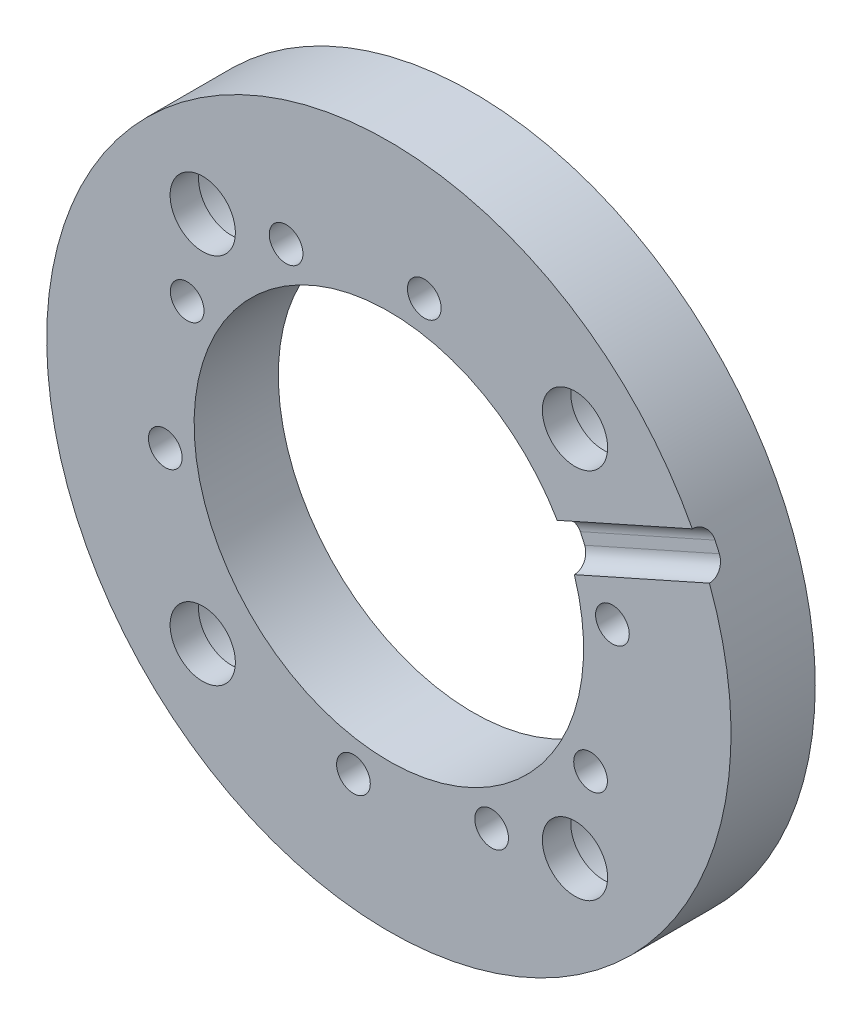
ISO-10303-21;
HEADER;
FILE_DESCRIPTION(('STEP AP214'),'2;1');
FILE_NAME('part.step','',(''),(''),'','','');
FILE_SCHEMA(('AUTOMOTIVE_DESIGN { 1 0 10303 214 1 1 1 1 }'));
ENDSEC;
DATA;
#1=APPLICATION_CONTEXT('core data for automotive mechanical design processes');
#2=APPLICATION_PROTOCOL_DEFINITION('international standard','automotive_design',2000,#1);
#3=PRODUCT_CONTEXT('',#1,'mechanical');
#4=PRODUCT('Part','Part','',(#3));
#5=PRODUCT_RELATED_PRODUCT_CATEGORY('part','',(#4));
#6=PRODUCT_DEFINITION_FORMATION('','',#4);
#7=PRODUCT_DEFINITION_CONTEXT('part definition',#1,'design');
#8=PRODUCT_DEFINITION('design','',#6,#7);
#9=PRODUCT_DEFINITION_SHAPE('','',#8);
#10=(LENGTH_UNIT() NAMED_UNIT(*) SI_UNIT(.MILLI.,.METRE.));
#11=(NAMED_UNIT(*) PLANE_ANGLE_UNIT() SI_UNIT($,.RADIAN.));
#12=(NAMED_UNIT(*) SI_UNIT($,.STERADIAN.) SOLID_ANGLE_UNIT());
#13=UNCERTAINTY_MEASURE_WITH_UNIT(LENGTH_MEASURE(1.E-05),#10,'distance_accuracy_value','');
#14=(GEOMETRIC_REPRESENTATION_CONTEXT(3) GLOBAL_UNCERTAINTY_ASSIGNED_CONTEXT((#13)) GLOBAL_UNIT_ASSIGNED_CONTEXT((#10,
#11,#12)) REPRESENTATION_CONTEXT('',''));
#15=CARTESIAN_POINT('',(0.,0.,0.));
#16=DIRECTION('',(0.,0.,1.));
#17=DIRECTION('',(1.,0.,0.));
#18=AXIS2_PLACEMENT_3D('',#15,#16,#17);
#19=CARTESIAN_POINT('',(-17.6776695296636,-17.6776695296637,8.));
#20=DIRECTION('',(0.,0.,-1.));
#21=DIRECTION('',(-1.,0.,0.));
#22=AXIS2_PLACEMENT_3D('',#19,#20,#21);
#23=CYLINDRICAL_SURFACE('',#22,3.10000000000017);
#24=CARTESIAN_POINT('',(-17.6776695296636,-17.6776695296637,5.3));
#25=DIRECTION('',(0.,0.,1.));
#26=DIRECTION('',(1.,0.,0.));
#27=AXIS2_PLACEMENT_3D('',#24,#25,#26);
#28=CIRCLE('',#27,3.10000000000017);
#29=CARTESIAN_POINT('',(-14.5776695296635,-17.6776695296637,5.3));
#30=VERTEX_POINT('',#29);
#31=EDGE_CURVE('E303',#30,#30,#28,.T.);
#32=ORIENTED_EDGE('',*,*,#31,.F.);
#33=EDGE_LOOP('',(#32));
#34=FACE_BOUND('',#33,.T.);
#35=CARTESIAN_POINT('',(-17.6776695296636,-17.6776695296637,8.));
#36=DIRECTION('',(0.,0.,1.));
#37=DIRECTION('',(1.,0.,0.));
#38=AXIS2_PLACEMENT_3D('',#35,#36,#37);
#39=CIRCLE('',#38,3.10000000000017);
#40=CARTESIAN_POINT('',(-14.5776695296635,-17.6776695296637,8.));
#41=VERTEX_POINT('',#40);
#42=EDGE_CURVE('E114',#41,#41,#39,.T.);
#43=ORIENTED_EDGE('',*,*,#42,.T.);
#44=EDGE_LOOP('',(#43));
#45=FACE_BOUND('',#44,.T.);
#46=ADVANCED_FACE('F41',(#34,#45),#23,.F.);
#47=CARTESIAN_POINT('',(-17.6776695296637,17.6776695296636,8.));
#48=DIRECTION('',(0.,0.,-1.));
#49=DIRECTION('',(-1.,0.,0.));
#50=AXIS2_PLACEMENT_3D('',#47,#48,#49);
#51=CYLINDRICAL_SURFACE('',#50,3.1);
#52=CARTESIAN_POINT('',(-17.6776695296637,17.6776695296636,5.3));
#53=DIRECTION('',(0.,0.,1.));
#54=DIRECTION('',(1.,0.,0.));
#55=AXIS2_PLACEMENT_3D('',#52,#53,#54);
#56=CIRCLE('',#55,3.1);
#57=CARTESIAN_POINT('',(-14.5776695296637,17.6776695296636,5.3));
#58=VERTEX_POINT('',#57);
#59=EDGE_CURVE('E290',#58,#58,#56,.T.);
#60=ORIENTED_EDGE('',*,*,#59,.F.);
#61=EDGE_LOOP('',(#60));
#62=FACE_BOUND('',#61,.T.);
#63=CARTESIAN_POINT('',(-17.6776695296637,17.6776695296636,8.));
#64=DIRECTION('',(0.,0.,1.));
#65=DIRECTION('',(1.,0.,0.));
#66=AXIS2_PLACEMENT_3D('',#63,#64,#65);
#67=CIRCLE('',#66,3.1);
#68=CARTESIAN_POINT('',(-14.5776695296637,17.6776695296636,8.));
#69=VERTEX_POINT('',#68);
#70=EDGE_CURVE('E267',#69,#69,#67,.T.);
#71=ORIENTED_EDGE('',*,*,#70,.T.);
#72=EDGE_LOOP('',(#71));
#73=FACE_BOUND('',#72,.T.);
#74=ADVANCED_FACE('F161',(#62,#73),#51,.F.);
#75=CARTESIAN_POINT('',(17.6776695296637,17.6776695296637,8.));
#76=DIRECTION('',(0.,0.,-1.));
#77=DIRECTION('',(-1.,0.,0.));
#78=AXIS2_PLACEMENT_3D('',#75,#76,#77);
#79=CYLINDRICAL_SURFACE('',#78,3.1);
#80=CARTESIAN_POINT('',(17.6776695296637,17.6776695296637,5.3));
#81=DIRECTION('',(0.,0.,1.));
#82=DIRECTION('',(1.,0.,0.));
#83=AXIS2_PLACEMENT_3D('',#80,#81,#82);
#84=CIRCLE('',#83,3.1);
#85=CARTESIAN_POINT('',(20.7776695296637,17.6776695296637,5.3));
#86=VERTEX_POINT('',#85);
#87=EDGE_CURVE('E280',#86,#86,#84,.T.);
#88=ORIENTED_EDGE('',*,*,#87,.F.);
#89=EDGE_LOOP('',(#88));
#90=FACE_BOUND('',#89,.T.);
#91=CARTESIAN_POINT('',(17.6776695296637,17.6776695296637,8.));
#92=DIRECTION('',(0.,0.,1.));
#93=DIRECTION('',(1.,0.,0.));
#94=AXIS2_PLACEMENT_3D('',#91,#92,#93);
#95=CIRCLE('',#94,3.1);
#96=CARTESIAN_POINT('',(20.7776695296637,17.6776695296637,8.));
#97=VERTEX_POINT('',#96);
#98=EDGE_CURVE('E102',#97,#97,#95,.T.);
#99=ORIENTED_EDGE('',*,*,#98,.T.);
#100=EDGE_LOOP('',(#99));
#101=FACE_BOUND('',#100,.T.);
#102=ADVANCED_FACE('F153',(#90,#101),#79,.F.);
#103=CARTESIAN_POINT('',(0.,0.,8.));
#104=DIRECTION('',(0.,0.,-1.));
#105=DIRECTION('',(-1.,0.,0.));
#106=AXIS2_PLACEMENT_3D('',#103,#104,#105);
#107=CYLINDRICAL_SURFACE('',#106,32.5);
#108=CARTESIAN_POINT('',(0.,0.,8.));
#109=DIRECTION('',(0.,0.,1.));
#110=DIRECTION('',(1.,0.,0.));
#111=AXIS2_PLACEMENT_3D('',#108,#109,#110);
#112=CIRCLE('',#111,32.5);
#113=CARTESIAN_POINT('',(28.8204825798909,15.0209781260144,8.));
#114=VERTEX_POINT('',#113);
#115=CARTESIAN_POINT('',(30.4474291521941,11.366796295444,8.));
#116=VERTEX_POINT('',#115);
#117=EDGE_CURVE('E90',#114,#116,#112,.T.);
#118=ORIENTED_EDGE('',*,*,#117,.F.);
#119=CARTESIAN_POINT('',(28.8204825798909,15.0209781260144,8.));
#120=CARTESIAN_POINT('',(28.820482254931,15.0209777250137,7.95784392466187));
#121=CARTESIAN_POINT('',(28.8213060683507,15.01939822818,7.91570807938129));
#122=CARTESIAN_POINT('',(28.8245896321532,15.0130959887507,7.8317386113487));
#123=CARTESIAN_POINT('',(28.8270492938715,15.0083734165125,7.78990497234107));
#124=CARTESIAN_POINT('',(28.8368524106547,14.9895348988056,7.66538622060936));
#125=CARTESIAN_POINT('',(28.8466200905457,14.9707480300527,7.58353629685353));
#126=CARTESIAN_POINT('',(28.8722737388597,14.921212345629,7.42455693511093));
#127=CARTESIAN_POINT('',(28.8881624625773,14.8904581429821,7.34742964108981));
#128=CARTESIAN_POINT('',(28.925490073675,14.8178164712849,7.20007215072111));
#129=CARTESIAN_POINT('',(28.9469281264252,14.7759306764225,7.12984091938135));
#130=CARTESIAN_POINT('',(28.9946334093422,14.6820978859544,6.99818278185046));
#131=CARTESIAN_POINT('',(29.0209059961161,14.6301397268382,6.93676577740842));
#132=CARTESIAN_POINT('',(29.0773760501031,14.5175809949502,6.8245469356392));
#133=CARTESIAN_POINT('',(29.1075742960054,14.4569787073066,6.77374720957013));
#134=CARTESIAN_POINT('',(29.1709319336428,14.3287071736537,6.68415524729376));
#135=CARTESIAN_POINT('',(29.2040953194536,14.2610283740763,6.64537953131189));
#136=CARTESIAN_POINT('',(29.272279482007,14.1205429375697,6.58104833404386));
#137=CARTESIAN_POINT('',(29.3072991460254,14.0477393642296,6.55548502936798));
#138=CARTESIAN_POINT('',(29.3660146649431,13.9244437206533,6.52463115771624));
#139=CARTESIAN_POINT('',(29.3895027218427,13.8748027769776,6.51540077207948));
#140=CARTESIAN_POINT('',(29.436483060441,13.7748517717456,6.5030858134872));
#141=CARTESIAN_POINT('',(29.4599752909822,13.7245427350557,6.4999927241683));
#142=CARTESIAN_POINT('',(29.483345207539,13.6741491645033,6.5));
#143=B_SPLINE_CURVE_WITH_KNOTS('',3,(#119,#120,#121,#122,#123,#124,#125,#126,#127,#128,#129,
#130,#131,#132,#133,#134,#135,#136,#137,#138,#139,#140,#141,#142),.UNSPECIFIED.,.F.,.F.,(4,2,2,
2,2,2,2,2,2,2,2,4),(0.,0.126390434607027,0.252774019300377,0.505105879379107,0.75755145576971,
1.00995908589155,1.2626480832942,1.51538728049023,1.76847220225855,2.02140709411676,
2.18814972153659,2.35466080780035),.UNSPECIFIED.);
#144=CARTESIAN_POINT('',(29.483345207539,13.6741491645033,6.5));
#145=VERTEX_POINT('',#144);
#146=EDGE_CURVE('E70',#114,#145,#143,.T.);
#147=ORIENTED_EDGE('',*,*,#146,.T.);
#148=CARTESIAN_POINT('',(0.,0.,6.5));
#149=DIRECTION('',(0.,0.,-1.));
#150=DIRECTION('',(-1.,0.,0.));
#151=AXIS2_PLACEMENT_3D('',#148,#149,#150);
#152=CIRCLE('',#151,32.5);
#153=CARTESIAN_POINT('',(29.8900818506148,12.7606037068607,6.5));
#154=VERTEX_POINT('',#153);
#155=EDGE_CURVE('E91',#145,#154,#152,.T.);
#156=ORIENTED_EDGE('',*,*,#155,.T.);
#157=CARTESIAN_POINT('',(29.8900818506148,12.7606037068607,6.5));
#158=CARTESIAN_POINT('',(29.9066538793367,12.7217870228504,6.50000025653169));
#159=CARTESIAN_POINT('',(29.923141383252,12.6829563157621,6.50178205968444));
#160=CARTESIAN_POINT('',(29.9558489567163,12.6055097481665,6.50888959441266));
#161=CARTESIAN_POINT('',(29.9720690408145,12.5668938760468,6.5142151325304));
#162=CARTESIAN_POINT('',(30.0201288149045,12.4518568743887,6.53545481473923));
#163=CARTESIAN_POINT('',(30.0514249934655,12.37611283941,6.55663217746557));
#164=CARTESIAN_POINT('',(30.1116854951004,12.228767496804,6.61242818330965));
#165=CARTESIAN_POINT('',(30.1406487646226,12.1571680649584,6.64705285865403));
#166=CARTESIAN_POINT('',(30.1955399261491,12.0201836161517,6.72875562206615));
#167=CARTESIAN_POINT('',(30.2214682854676,11.9547976427372,6.7758317892097));
#168=CARTESIAN_POINT('',(30.2697179366694,11.832097687657,6.88115123009997));
#169=CARTESIAN_POINT('',(30.2920361375668,11.7747906284227,6.93940398083845));
#170=CARTESIAN_POINT('',(30.3325644080703,11.6699914922614,7.065418847027));
#171=CARTESIAN_POINT('',(30.3507736858683,11.6225013072382,7.13318279125315));
#172=CARTESIAN_POINT('',(30.382710822285,11.538756419885,7.27630355965674));
#173=CARTESIAN_POINT('',(30.3964374784227,11.5025047324586,7.35166241411603));
#174=CARTESIAN_POINT('',(30.4191294944356,11.4423599192547,7.50781004169035));
#175=CARTESIAN_POINT('',(30.4280977211173,11.4184593525353,7.58859551230668));
#176=CARTESIAN_POINT('',(30.4388720432389,11.3896978077847,7.72489920893655));
#177=CARTESIAN_POINT('',(30.442080488799,11.3811159246959,7.77955438586827));
#178=CARTESIAN_POINT('',(30.4463580433644,11.369665454334,7.88946529473925));
#179=CARTESIAN_POINT('',(30.4474301310718,11.3667889121884,7.94472008234201));
#180=CARTESIAN_POINT('',(30.4474291521941,11.366796295444,8.));
#181=B_SPLINE_CURVE_WITH_KNOTS('',3,(#157,#158,#159,#160,#161,#162,#163,#164,#165,#166,#167,
#168,#169,#170,#171,#172,#173,#174,#175,#176,#177,#178,#179,#180),.UNSPECIFIED.,.F.,.F.,(4,2,2,
2,2,2,2,2,2,2,2,4),(0.,0.126540793011442,0.253074678541132,0.505712504215108,0.758463789891964,
1.01117610568732,1.26410365920113,1.51707991145309,1.77012396994769,2.02301540361321,
2.1889526482996,2.35465836603808),.UNSPECIFIED.);
#182=EDGE_CURVE('E56',#154,#116,#181,.T.);
#183=ORIENTED_EDGE('',*,*,#182,.T.);
#184=EDGE_LOOP('',(#118,#147,#156,#183));
#185=FACE_BOUND('',#184,.T.);
#186=CARTESIAN_POINT('',(0.,0.,0.));
#187=DIRECTION('',(0.,0.,1.));
#188=DIRECTION('',(1.,0.,0.));
#189=AXIS2_PLACEMENT_3D('',#186,#187,#188);
#190=CIRCLE('',#189,32.5);
#191=CARTESIAN_POINT('',(32.5,0.,0.));
#192=VERTEX_POINT('',#191);
#193=EDGE_CURVE('E117',#192,#192,#190,.T.);
#194=ORIENTED_EDGE('',*,*,#193,.T.);
#195=EDGE_LOOP('',(#194));
#196=FACE_BOUND('',#195,.T.);
#197=ADVANCED_FACE('F88',(#185,#196),#107,.T.);
#198=CARTESIAN_POINT('',(0.,0.,8.));
#199=DIRECTION('',(0.,0.,-1.));
#200=DIRECTION('',(-1.,0.,0.));
#201=AXIS2_PLACEMENT_3D('',#198,#199,#200);
#202=CYLINDRICAL_SURFACE('',#201,18.5);
#203=CARTESIAN_POINT('',(0.,0.,6.5));
#204=DIRECTION('',(0.,0.,-1.));
#205=DIRECTION('',(-1.,0.,0.));
#206=AXIS2_PLACEMENT_3D('',#203,#204,#205);
#207=CIRCLE('',#206,18.5);
#208=CARTESIAN_POINT('',(16.6910489127844,7.97865190311243,6.5));
#209=VERTEX_POINT('',#208);
#210=CARTESIAN_POINT('',(17.0977855558602,7.06510644546983,6.5));
#211=VERTEX_POINT('',#210);
#212=EDGE_CURVE('E111',#209,#211,#207,.T.);
#213=ORIENTED_EDGE('',*,*,#212,.F.);
#214=CARTESIAN_POINT('',(16.6910489127844,7.97865190311243,6.5));
#215=CARTESIAN_POINT('',(16.6728433696581,8.01673911332421,6.50000020622001));
#216=CARTESIAN_POINT('',(16.6545146518703,8.05474478725962,6.50178188332618));
#217=CARTESIAN_POINT('',(16.6177321589642,8.13035923339829,6.50888723931646));
#218=CARTESIAN_POINT('',(16.5992783924816,8.16796803255921,6.51421067603338));
#219=CARTESIAN_POINT('',(16.5439742076894,8.27972177031654,6.53543704634188));
#220=CARTESIAN_POINT('',(16.5071144034155,8.35293302530529,6.55659621381391));
#221=CARTESIAN_POINT('',(16.4346143276334,8.49469316433795,6.6123236410866));
#222=CARTESIAN_POINT('',(16.3989745299106,8.5632402470481,6.64689704739193));
#223=CARTESIAN_POINT('',(16.3301074044518,8.6938509265145,6.72846356749991));
#224=CARTESIAN_POINT('',(16.2968798150784,8.75591522673946,6.77545533178686));
#225=CARTESIAN_POINT('',(16.2339298398115,8.87208588740481,6.88067740692866));
#226=CARTESIAN_POINT('',(16.2042169878227,8.92617069695289,6.93893720508047));
#227=CARTESIAN_POINT('',(16.1494986181355,9.02479268926952,7.06499561743319));
#228=CARTESIAN_POINT('',(16.1244939798098,9.06932808867036,7.13279600944648));
#229=CARTESIAN_POINT('',(16.0801628148761,9.14769913159274,7.27604545683033));
#230=CARTESIAN_POINT('',(16.0608388000739,9.18153004240548,7.35149787593046));
#231=CARTESIAN_POINT('',(16.028673744335,9.23756832820709,7.50787814944488));
#232=CARTESIAN_POINT('',(16.0158285737925,9.25978310763367,7.58880247866785));
#233=CARTESIAN_POINT('',(16.0003773821154,9.28644557707134,7.72519465587206));
#234=CARTESIAN_POINT('',(15.9957665880163,9.29438086031875,7.77978703180128));
#235=CARTESIAN_POINT('',(15.9896096046705,9.30496616811764,7.88957830277057));
#236=CARTESIAN_POINT('',(15.9880593126131,9.30762326846131,7.94477628593417));
#237=CARTESIAN_POINT('',(15.9880657445575,9.30761804908784,8.));
#238=B_SPLINE_CURVE_WITH_KNOTS('',3,(#214,#215,#216,#217,#218,#219,#220,#221,#222,#223,#224,
#225,#226,#227,#228,#229,#230,#231,#232,#233,#234,#235,#236,#237),.UNSPECIFIED.,.F.,.F.,(4,2,2,
2,2,2,2,2,2,2,2,4),(0.,0.126565667178966,0.253122681342033,0.505780411588499,0.758535172463492,
1.01126247750618,1.2646603182284,1.51810544026872,1.77166246035121,2.02505765866927,
2.19081565258614,2.35635128536074),.UNSPECIFIED.);
#239=CARTESIAN_POINT('',(15.9880657445575,9.30761804908784,8.));
#240=VERTEX_POINT('',#239);
#241=EDGE_CURVE('E130',#209,#240,#238,.T.);
#242=ORIENTED_EDGE('',*,*,#241,.T.);
#243=CARTESIAN_POINT('',(0.,0.,8.));
#244=DIRECTION('',(0.,0.,1.));
#245=DIRECTION('',(1.,0.,0.));
#246=AXIS2_PLACEMENT_3D('',#243,#244,#245);
#247=CIRCLE('',#246,18.5);
#248=CARTESIAN_POINT('',(17.6150123168607,5.65343621851743,8.));
#249=VERTEX_POINT('',#248);
#250=EDGE_CURVE('E103',#240,#249,#247,.T.);
#251=ORIENTED_EDGE('',*,*,#250,.T.);
#252=CARTESIAN_POINT('',(17.6150123168607,5.65343621851743,8.));
#253=CARTESIAN_POINT('',(17.6150115105771,5.65343600970903,7.95794017941649));
#254=CARTESIAN_POINT('',(17.6144682725476,5.65513165809695,7.9159006146221));
#255=CARTESIAN_POINT('',(17.6122963959348,5.66189317154893,7.83212449879919));
#256=CARTESIAN_POINT('',(17.6106678303843,5.66695880984271,7.79038792757292));
#257=CARTESIAN_POINT('',(17.6041613670784,5.68715354777901,7.66617328767416));
#258=CARTESIAN_POINT('',(17.5976626963171,5.70728065349919,7.5845307055815));
#259=CARTESIAN_POINT('',(17.5804013644206,5.76023036377027,7.42596227046548));
#260=CARTESIAN_POINT('',(17.5696370483686,5.79305789551228,7.34903826147032));
#261=CARTESIAN_POINT('',(17.5439551344273,5.87037402485161,7.20204931246578));
#262=CARTESIAN_POINT('',(17.5290379386833,5.91486149333171,7.1319837092085));
#263=CARTESIAN_POINT('',(17.4951686402214,6.01430249643139,7.00043484577409));
#264=CARTESIAN_POINT('',(17.4762027425748,6.06929174395276,6.93898214866821));
#265=CARTESIAN_POINT('',(17.4345285193655,6.18798539065007,6.82664517703824));
#266=CARTESIAN_POINT('',(17.411819426812,6.25169157549488,6.77576307329746));
#267=CARTESIAN_POINT('',(17.362949460218,6.38616618959485,6.6858377675927));
#268=CARTESIAN_POINT('',(17.3367756825637,6.4569607656555,6.64684071622482));
#269=CARTESIAN_POINT('',(17.2815651822569,6.60330247084922,6.58208162655767));
#270=CARTESIAN_POINT('',(17.2525302030355,6.67884669581811,6.55631158728944));
#271=CARTESIAN_POINT('',(17.2024326418616,6.80656389552013,6.52506065442348));
#272=CARTESIAN_POINT('',(17.1819734783515,6.85805097170174,6.51567086221277));
#273=CARTESIAN_POINT('',(17.1403548712566,6.96141995098383,6.50314074917805));
#274=CARTESIAN_POINT('',(17.1191963881077,7.01330124290755,6.49999219196318));
#275=CARTESIAN_POINT('',(17.0977855558602,7.06510644546983,6.5));
#276=B_SPLINE_CURVE_WITH_KNOTS('',3,(#252,#253,#254,#255,#256,#257,#258,#259,#260,#261,#262,
#263,#264,#265,#266,#267,#268,#269,#270,#271,#272,#273,#274,#275),.UNSPECIFIED.,.F.,.F.,(4,2,2,
2,2,2,2,2,2,2,2,4),(0.,0.126101613195977,0.252194741735852,0.503908356320897,0.755719722490934,
1.00750671292246,1.26016570180788,1.5128765257142,1.76655649714378,2.02008283714987,
2.18833189358473,2.35635876803012),.UNSPECIFIED.);
#277=EDGE_CURVE('E11',#249,#211,#276,.T.);
#278=ORIENTED_EDGE('',*,*,#277,.T.);
#279=EDGE_LOOP('',(#213,#242,#251,#278));
#280=FACE_BOUND('',#279,.T.);
#281=CARTESIAN_POINT('',(0.,0.,0.));
#282=DIRECTION('',(0.,0.,1.));
#283=DIRECTION('',(1.,0.,0.));
#284=AXIS2_PLACEMENT_3D('',#281,#282,#283);
#285=CIRCLE('',#284,18.5);
#286=CARTESIAN_POINT('',(18.5,0.,0.));
#287=VERTEX_POINT('',#286);
#288=EDGE_CURVE('E259',#287,#287,#285,.T.);
#289=ORIENTED_EDGE('',*,*,#288,.F.);
#290=EDGE_LOOP('',(#289));
#291=FACE_BOUND('',#290,.T.);
#292=ADVANCED_FACE('F144',(#280,#291),#202,.F.);
#293=CARTESIAN_POINT('',(17.6776695296637,-17.6776695296636,8.));
#294=DIRECTION('',(0.,0.,-1.));
#295=DIRECTION('',(-1.,0.,0.));
#296=AXIS2_PLACEMENT_3D('',#293,#294,#295);
#297=CYLINDRICAL_SURFACE('',#296,3.10000000000009);
#298=CARTESIAN_POINT('',(17.6776695296637,-17.6776695296636,5.3));
#299=DIRECTION('',(0.,0.,1.));
#300=DIRECTION('',(1.,0.,0.));
#301=AXIS2_PLACEMENT_3D('',#298,#299,#300);
#302=CIRCLE('',#301,3.10000000000009);
#303=CARTESIAN_POINT('',(20.7776695296638,-17.6776695296636,5.3));
#304=VERTEX_POINT('',#303);
#305=EDGE_CURVE('E315',#304,#304,#302,.T.);
#306=ORIENTED_EDGE('',*,*,#305,.F.);
#307=EDGE_LOOP('',(#306));
#308=FACE_BOUND('',#307,.T.);
#309=CARTESIAN_POINT('',(17.6776695296637,-17.6776695296636,8.));
#310=DIRECTION('',(0.,0.,1.));
#311=DIRECTION('',(1.,0.,0.));
#312=AXIS2_PLACEMENT_3D('',#309,#310,#311);
#313=CIRCLE('',#312,3.10000000000009);
#314=CARTESIAN_POINT('',(20.7776695296638,-17.6776695296636,8.));
#315=VERTEX_POINT('',#314);
#316=EDGE_CURVE('E107',#315,#315,#313,.T.);
#317=ORIENTED_EDGE('',*,*,#316,.T.);
#318=EDGE_LOOP('',(#317));
#319=FACE_BOUND('',#318,.T.);
#320=ADVANCED_FACE('F147',(#308,#319),#297,.F.);
#321=CARTESIAN_POINT('',(0.,0.,8.));
#322=DIRECTION('',(0.,0.,1.));
#323=DIRECTION('',(1.,0.,0.));
#324=AXIS2_PLACEMENT_3D('',#321,#322,#323);
#325=PLANE('',#324);
#326=DIRECTION('',(-0.913545457642602,-0.406736643075798,0.));
#327=VECTOR('',#326,1.);
#328=CARTESIAN_POINT('',(-0.813473286151596,1.82709091528521,8.));
#329=LINE('',#328,#327);
#330=EDGE_CURVE('E100',#114,#240,#329,.T.);
#331=ORIENTED_EDGE('',*,*,#330,.F.);
#332=ORIENTED_EDGE('',*,*,#117,.T.);
#333=DIRECTION('',(0.913545457642602,0.406736643075798,0.));
#334=VECTOR('',#333,1.);
#335=CARTESIAN_POINT('',(0.813473286151596,-1.8270909152852,8.));
#336=LINE('',#335,#334);
#337=EDGE_CURVE('E97',#249,#116,#336,.T.);
#338=ORIENTED_EDGE('',*,*,#337,.F.);
#339=ORIENTED_EDGE('',*,*,#250,.F.);
#340=EDGE_LOOP('',(#331,#332,#338,#339));
#341=FACE_BOUND('',#340,.T.);
#342=CARTESIAN_POINT('',(-19.1566402700505,9.76079574440062,8.));
#343=DIRECTION('',(0.,0.,1.));
#344=DIRECTION('',(1.,0.,0.));
#345=AXIS2_PLACEMENT_3D('',#342,#343,#344);
#346=CIRCLE('',#345,1.6);
#347=CARTESIAN_POINT('',(-17.5566402700505,9.76079574440062,8.));
#348=VERTEX_POINT('',#347);
#349=EDGE_CURVE('E291',#348,#348,#346,.T.);
#350=ORIENTED_EDGE('',*,*,#349,.F.);
#351=EDGE_LOOP('',(#350));
#352=FACE_BOUND('',#351,.T.);
#353=CARTESIAN_POINT('',(-21.2352993227967,-3.36334099836451,8.));
#354=DIRECTION('',(0.,0.,1.));
#355=DIRECTION('',(1.,0.,0.));
#356=AXIS2_PLACEMENT_3D('',#353,#354,#355);
#357=CIRCLE('',#356,1.6);
#358=CARTESIAN_POINT('',(-19.6352993227967,-3.36334099836451,8.));
#359=VERTEX_POINT('',#358);
#360=EDGE_CURVE('E326',#359,#359,#357,.T.);
#361=ORIENTED_EDGE('',*,*,#360,.F.);
#362=EDGE_LOOP('',(#361));
#363=FACE_BOUND('',#362,.T.);
#364=CARTESIAN_POINT('',(-3.36334099836708,-21.2352993227959,8.));
#365=DIRECTION('',(0.,0.,1.));
#366=DIRECTION('',(1.,0.,0.));
#367=AXIS2_PLACEMENT_3D('',#364,#365,#366);
#368=CIRCLE('',#367,1.6);
#369=CARTESIAN_POINT('',(-1.76334099836708,-21.2352993227959,8.));
#370=VERTEX_POINT('',#369);
#371=EDGE_CURVE('E330',#370,#370,#368,.T.);
#372=ORIENTED_EDGE('',*,*,#371,.F.);
#373=EDGE_LOOP('',(#372));
#374=FACE_BOUND('',#373,.T.);
#375=CARTESIAN_POINT('',(9.76079574439825,-19.156640270051,8.));
#376=DIRECTION('',(0.,0.,1.));
#377=DIRECTION('',(1.,0.,0.));
#378=AXIS2_PLACEMENT_3D('',#375,#376,#377);
#379=CIRCLE('',#378,1.6);
#380=CARTESIAN_POINT('',(11.3607957443982,-19.156640270051,8.));
#381=VERTEX_POINT('',#380);
#382=EDGE_CURVE('E334',#381,#381,#379,.T.);
#383=ORIENTED_EDGE('',*,*,#382,.F.);
#384=EDGE_LOOP('',(#383));
#385=FACE_BOUND('',#384,.T.);
#386=CARTESIAN_POINT('',(19.1566402700484,-9.76079574440176,8.));
#387=DIRECTION('',(0.,0.,1.));
#388=DIRECTION('',(1.,0.,0.));
#389=AXIS2_PLACEMENT_3D('',#386,#387,#388);
#390=CIRCLE('',#389,1.6);
#391=CARTESIAN_POINT('',(20.7566402700484,-9.76079574440176,8.));
#392=VERTEX_POINT('',#391);
#393=EDGE_CURVE('E338',#392,#392,#390,.T.);
#394=ORIENTED_EDGE('',*,*,#393,.F.);
#395=EDGE_LOOP('',(#394));
#396=FACE_BOUND('',#395,.T.);
#397=CARTESIAN_POINT('',(21.2352993227945,3.36334099836337,8.));
#398=DIRECTION('',(0.,0.,1.));
#399=DIRECTION('',(1.,0.,0.));
#400=AXIS2_PLACEMENT_3D('',#397,#398,#399);
#401=CIRCLE('',#400,1.6);
#402=CARTESIAN_POINT('',(22.8352993227946,3.36334099836337,8.));
#403=VERTEX_POINT('',#402);
#404=EDGE_CURVE('E342',#403,#403,#401,.T.);
#405=ORIENTED_EDGE('',*,*,#404,.F.);
#406=EDGE_LOOP('',(#405));
#407=FACE_BOUND('',#406,.T.);
#408=CARTESIAN_POINT('',(3.36334099836491,21.2352993227947,8.));
#409=DIRECTION('',(0.,0.,1.));
#410=DIRECTION('',(1.,0.,0.));
#411=AXIS2_PLACEMENT_3D('',#408,#409,#410);
#412=CIRCLE('',#411,1.6);
#413=CARTESIAN_POINT('',(4.96334099836491,21.2352993227947,8.));
#414=VERTEX_POINT('',#413);
#415=EDGE_CURVE('E346',#414,#414,#412,.T.);
#416=ORIENTED_EDGE('',*,*,#415,.F.);
#417=EDGE_LOOP('',(#416));
#418=FACE_BOUND('',#417,.T.);
#419=CARTESIAN_POINT('',(-9.76079574440041,19.1566402700498,8.));
#420=DIRECTION('',(0.,0.,1.));
#421=DIRECTION('',(1.,0.,0.));
#422=AXIS2_PLACEMENT_3D('',#419,#420,#421);
#423=CIRCLE('',#422,1.6);
#424=CARTESIAN_POINT('',(-8.16079574440041,19.1566402700498,8.));
#425=VERTEX_POINT('',#424);
#426=EDGE_CURVE('E350',#425,#425,#423,.T.);
#427=ORIENTED_EDGE('',*,*,#426,.F.);
#428=EDGE_LOOP('',(#427));
#429=FACE_BOUND('',#428,.T.);
#430=ORIENTED_EDGE('',*,*,#98,.F.);
#431=EDGE_LOOP('',(#430));
#432=FACE_BOUND('',#431,.T.);
#433=ORIENTED_EDGE('',*,*,#70,.F.);
#434=EDGE_LOOP('',(#433));
#435=FACE_BOUND('',#434,.T.);
#436=ORIENTED_EDGE('',*,*,#42,.F.);
#437=EDGE_LOOP('',(#436));
#438=FACE_BOUND('',#437,.T.);
#439=ORIENTED_EDGE('',*,*,#316,.F.);
#440=EDGE_LOOP('',(#439));
#441=FACE_BOUND('',#440,.T.);
#442=ADVANCED_FACE('F94',(#341,#352,#363,#374,#385,#396,#407,#418,#429,#432,#435,#438,#441),
#325,.T.);
#443=CARTESIAN_POINT('',(0.,0.,0.));
#444=DIRECTION('',(0.,0.,1.));
#445=DIRECTION('',(1.,0.,0.));
#446=AXIS2_PLACEMENT_3D('',#443,#444,#445);
#447=PLANE('',#446);
#448=CARTESIAN_POINT('',(-19.1566402700505,9.76079574440062,0.));
#449=DIRECTION('',(0.,0.,-1.));
#450=DIRECTION('',(-1.,0.,0.));
#451=AXIS2_PLACEMENT_3D('',#448,#449,#450);
#452=CIRCLE('',#451,1.6);
#453=CARTESIAN_POINT('',(-20.7566402700505,9.76079574440062,0.));
#454=VERTEX_POINT('',#453);
#455=EDGE_CURVE('E358',#454,#454,#452,.T.);
#456=ORIENTED_EDGE('',*,*,#455,.F.);
#457=EDGE_LOOP('',(#456));
#458=FACE_BOUND('',#457,.T.);
#459=CARTESIAN_POINT('',(-21.2352993227967,-3.36334099836451,0.));
#460=DIRECTION('',(0.,0.,-1.));
#461=DIRECTION('',(-1.,0.,0.));
#462=AXIS2_PLACEMENT_3D('',#459,#460,#461);
#463=CIRCLE('',#462,1.6);
#464=CARTESIAN_POINT('',(-22.8352993227967,-3.36334099836451,0.));
#465=VERTEX_POINT('',#464);
#466=EDGE_CURVE('E368',#465,#465,#463,.T.);
#467=ORIENTED_EDGE('',*,*,#466,.F.);
#468=EDGE_LOOP('',(#467));
#469=FACE_BOUND('',#468,.T.);
#470=CARTESIAN_POINT('',(-3.36334099836708,-21.2352993227959,0.));
#471=DIRECTION('',(0.,0.,-1.));
#472=DIRECTION('',(-1.,0.,0.));
#473=AXIS2_PLACEMENT_3D('',#470,#471,#472);
#474=CIRCLE('',#473,1.6);
#475=CARTESIAN_POINT('',(-4.96334099836708,-21.2352993227959,0.));
#476=VERTEX_POINT('',#475);
#477=EDGE_CURVE('E363',#476,#476,#474,.T.);
#478=ORIENTED_EDGE('',*,*,#477,.F.);
#479=EDGE_LOOP('',(#478));
#480=FACE_BOUND('',#479,.T.);
#481=CARTESIAN_POINT('',(9.76079574439825,-19.156640270051,0.));
#482=DIRECTION('',(0.,0.,-1.));
#483=DIRECTION('',(-1.,0.,0.));
#484=AXIS2_PLACEMENT_3D('',#481,#482,#483);
#485=CIRCLE('',#484,1.6);
#486=CARTESIAN_POINT('',(8.16079574439824,-19.156640270051,0.));
#487=VERTEX_POINT('',#486);
#488=EDGE_CURVE('E359',#487,#487,#485,.T.);
#489=ORIENTED_EDGE('',*,*,#488,.F.);
#490=EDGE_LOOP('',(#489));
#491=FACE_BOUND('',#490,.T.);
#492=CARTESIAN_POINT('',(19.1566402700484,-9.76079574440176,0.));
#493=DIRECTION('',(0.,0.,-1.));
#494=DIRECTION('',(-1.,0.,0.));
#495=AXIS2_PLACEMENT_3D('',#492,#493,#494);
#496=CIRCLE('',#495,1.6);
#497=CARTESIAN_POINT('',(17.5566402700484,-9.76079574440176,0.));
#498=VERTEX_POINT('',#497);
#499=EDGE_CURVE('E364',#498,#498,#496,.T.);
#500=ORIENTED_EDGE('',*,*,#499,.F.);
#501=EDGE_LOOP('',(#500));
#502=FACE_BOUND('',#501,.T.);
#503=CARTESIAN_POINT('',(21.2352993227945,3.36334099836337,0.));
#504=DIRECTION('',(0.,0.,-1.));
#505=DIRECTION('',(-1.,0.,0.));
#506=AXIS2_PLACEMENT_3D('',#503,#504,#505);
#507=CIRCLE('',#506,1.6);
#508=CARTESIAN_POINT('',(19.6352993227945,3.36334099836337,0.));
#509=VERTEX_POINT('',#508);
#510=EDGE_CURVE('E378',#509,#509,#507,.T.);
#511=ORIENTED_EDGE('',*,*,#510,.F.);
#512=EDGE_LOOP('',(#511));
#513=FACE_BOUND('',#512,.T.);
#514=CARTESIAN_POINT('',(3.36334099836491,21.2352993227947,0.));
#515=DIRECTION('',(0.,0.,-1.));
#516=DIRECTION('',(-1.,0.,0.));
#517=AXIS2_PLACEMENT_3D('',#514,#515,#516);
#518=CIRCLE('',#517,1.6);
#519=CARTESIAN_POINT('',(1.76334099836491,21.2352993227947,0.));
#520=VERTEX_POINT('',#519);
#521=EDGE_CURVE('E252',#520,#520,#518,.T.);
#522=ORIENTED_EDGE('',*,*,#521,.F.);
#523=EDGE_LOOP('',(#522));
#524=FACE_BOUND('',#523,.T.);
#525=CARTESIAN_POINT('',(-9.76079574440041,19.1566402700498,0.));
#526=DIRECTION('',(0.,0.,-1.));
#527=DIRECTION('',(-1.,0.,0.));
#528=AXIS2_PLACEMENT_3D('',#525,#526,#527);
#529=CIRCLE('',#528,1.6);
#530=CARTESIAN_POINT('',(-11.3607957444004,19.1566402700498,0.));
#531=VERTEX_POINT('',#530);
#532=EDGE_CURVE('E354',#531,#531,#529,.T.);
#533=ORIENTED_EDGE('',*,*,#532,.F.);
#534=EDGE_LOOP('',(#533));
#535=FACE_BOUND('',#534,.T.);
#536=CARTESIAN_POINT('',(-17.6776695296637,17.6776695296636,0.));
#537=DIRECTION('',(0.,0.,1.));
#538=DIRECTION('',(1.,0.,0.));
#539=AXIS2_PLACEMENT_3D('',#536,#537,#538);
#540=CIRCLE('',#539,5.55);
#541=CARTESIAN_POINT('',(-12.1276695296637,17.6776695296636,0.));
#542=VERTEX_POINT('',#541);
#543=EDGE_CURVE('E286',#542,#542,#540,.T.);
#544=ORIENTED_EDGE('',*,*,#543,.T.);
#545=EDGE_LOOP('',(#544));
#546=FACE_BOUND('',#545,.T.);
#547=CARTESIAN_POINT('',(-17.6776695296636,-17.6776695296637,0.));
#548=DIRECTION('',(0.,0.,1.));
#549=DIRECTION('',(1.,0.,0.));
#550=AXIS2_PLACEMENT_3D('',#547,#548,#549);
#551=CIRCLE('',#550,5.55);
#552=CARTESIAN_POINT('',(-12.1276695296637,-17.6776695296637,0.));
#553=VERTEX_POINT('',#552);
#554=EDGE_CURVE('E296',#553,#553,#551,.T.);
#555=ORIENTED_EDGE('',*,*,#554,.T.);
#556=EDGE_LOOP('',(#555));
#557=FACE_BOUND('',#556,.T.);
#558=CARTESIAN_POINT('',(17.6776695296637,-17.6776695296636,0.));
#559=DIRECTION('',(0.,0.,1.));
#560=DIRECTION('',(1.,0.,0.));
#561=AXIS2_PLACEMENT_3D('',#558,#559,#560);
#562=CIRCLE('',#561,5.55);
#563=CARTESIAN_POINT('',(23.2276695296637,-17.6776695296636,0.));
#564=VERTEX_POINT('',#563);
#565=EDGE_CURVE('E308',#564,#564,#562,.T.);
#566=ORIENTED_EDGE('',*,*,#565,.T.);
#567=EDGE_LOOP('',(#566));
#568=FACE_BOUND('',#567,.T.);
#569=CARTESIAN_POINT('',(17.6776695296637,17.6776695296637,0.));
#570=DIRECTION('',(0.,0.,1.));
#571=DIRECTION('',(1.,0.,0.));
#572=AXIS2_PLACEMENT_3D('',#569,#570,#571);
#573=CIRCLE('',#572,5.55);
#574=CARTESIAN_POINT('',(23.2276695296637,17.6776695296637,0.));
#575=VERTEX_POINT('',#574);
#576=EDGE_CURVE('E261',#575,#575,#573,.T.);
#577=ORIENTED_EDGE('',*,*,#576,.T.);
#578=EDGE_LOOP('',(#577));
#579=FACE_BOUND('',#578,.T.);
#580=ORIENTED_EDGE('',*,*,#288,.T.);
#581=EDGE_LOOP('',(#580));
#582=FACE_BOUND('',#581,.T.);
#583=ORIENTED_EDGE('',*,*,#193,.F.);
#584=EDGE_LOOP('',(#583));
#585=FACE_BOUND('',#584,.T.);
#586=ADVANCED_FACE('F172',(#458,#469,#480,#491,#502,#513,#524,#535,#546,#557,#568,#579,#582,
#585),#447,.F.);
#587=CARTESIAN_POINT('',(17.6776695296637,17.6776695296637,5.3));
#588=DIRECTION('',(0.,0.,-1.));
#589=DIRECTION('',(-1.,0.,0.));
#590=AXIS2_PLACEMENT_3D('',#587,#588,#589);
#591=CYLINDRICAL_SURFACE('',#590,5.55);
#592=CARTESIAN_POINT('',(17.6776695296637,17.6776695296637,5.3));
#593=DIRECTION('',(0.,0.,1.));
#594=DIRECTION('',(1.,0.,0.));
#595=AXIS2_PLACEMENT_3D('',#592,#593,#594);
#596=CIRCLE('',#595,5.55);
#597=CARTESIAN_POINT('',(23.2276695296637,17.6776695296637,5.3));
#598=VERTEX_POINT('',#597);
#599=EDGE_CURVE('E275',#598,#598,#596,.T.);
#600=ORIENTED_EDGE('',*,*,#599,.T.);
#601=EDGE_LOOP('',(#600));
#602=FACE_BOUND('',#601,.T.);
#603=ORIENTED_EDGE('',*,*,#576,.F.);
#604=EDGE_LOOP('',(#603));
#605=FACE_BOUND('',#604,.T.);
#606=ADVANCED_FACE('F175',(#602,#605),#591,.F.);
#607=CARTESIAN_POINT('',(0.,0.,5.3));
#608=DIRECTION('',(0.,0.,1.));
#609=DIRECTION('',(1.,0.,0.));
#610=AXIS2_PLACEMENT_3D('',#607,#608,#609);
#611=PLANE('',#610);
#612=ORIENTED_EDGE('',*,*,#87,.T.);
#613=EDGE_LOOP('',(#612));
#614=FACE_BOUND('',#613,.T.);
#615=ORIENTED_EDGE('',*,*,#599,.F.);
#616=EDGE_LOOP('',(#615));
#617=FACE_BOUND('',#616,.T.);
#618=ADVANCED_FACE('F181',(#614,#617),#611,.F.);
#619=CARTESIAN_POINT('',(17.6776695296637,-17.6776695296636,5.3));
#620=DIRECTION('',(0.,0.,-1.));
#621=DIRECTION('',(-1.,0.,0.));
#622=AXIS2_PLACEMENT_3D('',#619,#620,#621);
#623=CYLINDRICAL_SURFACE('',#622,5.55);
#624=CARTESIAN_POINT('',(17.6776695296637,-17.6776695296636,5.3));
#625=DIRECTION('',(0.,0.,1.));
#626=DIRECTION('',(1.,0.,0.));
#627=AXIS2_PLACEMENT_3D('',#624,#625,#626);
#628=CIRCLE('',#627,5.55);
#629=CARTESIAN_POINT('',(23.2276695296637,-17.6776695296636,5.3));
#630=VERTEX_POINT('',#629);
#631=EDGE_CURVE('E316',#630,#630,#628,.T.);
#632=ORIENTED_EDGE('',*,*,#631,.T.);
#633=EDGE_LOOP('',(#632));
#634=FACE_BOUND('',#633,.T.);
#635=ORIENTED_EDGE('',*,*,#565,.F.);
#636=EDGE_LOOP('',(#635));
#637=FACE_BOUND('',#636,.T.);
#638=ADVANCED_FACE('F185',(#634,#637),#623,.F.);
#639=CARTESIAN_POINT('',(0.,0.,5.3));
#640=DIRECTION('',(0.,0.,1.));
#641=DIRECTION('',(1.,0.,0.));
#642=AXIS2_PLACEMENT_3D('',#639,#640,#641);
#643=PLANE('',#642);
#644=ORIENTED_EDGE('',*,*,#305,.T.);
#645=EDGE_LOOP('',(#644));
#646=FACE_BOUND('',#645,.T.);
#647=ORIENTED_EDGE('',*,*,#631,.F.);
#648=EDGE_LOOP('',(#647));
#649=FACE_BOUND('',#648,.T.);
#650=ADVANCED_FACE('F200',(#646,#649),#643,.F.);
#651=CARTESIAN_POINT('',(-17.6776695296636,-17.6776695296637,5.3));
#652=DIRECTION('',(0.,0.,-1.));
#653=DIRECTION('',(-1.,0.,0.));
#654=AXIS2_PLACEMENT_3D('',#651,#652,#653);
#655=CYLINDRICAL_SURFACE('',#654,5.55);
#656=CARTESIAN_POINT('',(-17.6776695296636,-17.6776695296637,5.3));
#657=DIRECTION('',(0.,0.,1.));
#658=DIRECTION('',(1.,0.,0.));
#659=AXIS2_PLACEMENT_3D('',#656,#657,#658);
#660=CIRCLE('',#659,5.55);
#661=CARTESIAN_POINT('',(-12.1276695296637,-17.6776695296637,5.3));
#662=VERTEX_POINT('',#661);
#663=EDGE_CURVE('E304',#662,#662,#660,.T.);
#664=ORIENTED_EDGE('',*,*,#663,.T.);
#665=EDGE_LOOP('',(#664));
#666=FACE_BOUND('',#665,.T.);
#667=ORIENTED_EDGE('',*,*,#554,.F.);
#668=EDGE_LOOP('',(#667));
#669=FACE_BOUND('',#668,.T.);
#670=ADVANCED_FACE('F197',(#666,#669),#655,.F.);
#671=CARTESIAN_POINT('',(0.,0.,5.3));
#672=DIRECTION('',(0.,0.,1.));
#673=DIRECTION('',(1.,0.,0.));
#674=AXIS2_PLACEMENT_3D('',#671,#672,#673);
#675=PLANE('',#674);
#676=ORIENTED_EDGE('',*,*,#31,.T.);
#677=EDGE_LOOP('',(#676));
#678=FACE_BOUND('',#677,.T.);
#679=ORIENTED_EDGE('',*,*,#663,.F.);
#680=EDGE_LOOP('',(#679));
#681=FACE_BOUND('',#680,.T.);
#682=ADVANCED_FACE('F191',(#678,#681),#675,.F.);
#683=CARTESIAN_POINT('',(-17.6776695296637,17.6776695296636,5.3));
#684=DIRECTION('',(0.,0.,-1.));
#685=DIRECTION('',(-1.,0.,0.));
#686=AXIS2_PLACEMENT_3D('',#683,#684,#685);
#687=CYLINDRICAL_SURFACE('',#686,5.55);
#688=CARTESIAN_POINT('',(-17.6776695296637,17.6776695296636,5.3));
#689=DIRECTION('',(0.,0.,1.));
#690=DIRECTION('',(1.,0.,0.));
#691=AXIS2_PLACEMENT_3D('',#688,#689,#690);
#692=CIRCLE('',#691,5.55);
#693=CARTESIAN_POINT('',(-12.1276695296637,17.6776695296636,5.3));
#694=VERTEX_POINT('',#693);
#695=EDGE_CURVE('E292',#694,#694,#692,.T.);
#696=ORIENTED_EDGE('',*,*,#695,.T.);
#697=EDGE_LOOP('',(#696));
#698=FACE_BOUND('',#697,.T.);
#699=ORIENTED_EDGE('',*,*,#543,.F.);
#700=EDGE_LOOP('',(#699));
#701=FACE_BOUND('',#700,.T.);
#702=ADVANCED_FACE('F187',(#698,#701),#687,.F.);
#703=CARTESIAN_POINT('',(0.,0.,5.3));
#704=DIRECTION('',(0.,0.,1.));
#705=DIRECTION('',(1.,0.,0.));
#706=AXIS2_PLACEMENT_3D('',#703,#704,#705);
#707=PLANE('',#706);
#708=ORIENTED_EDGE('',*,*,#59,.T.);
#709=EDGE_LOOP('',(#708));
#710=FACE_BOUND('',#709,.T.);
#711=ORIENTED_EDGE('',*,*,#695,.F.);
#712=EDGE_LOOP('',(#711));
#713=FACE_BOUND('',#712,.T.);
#714=ADVANCED_FACE('F190',(#710,#713),#707,.F.);
#715=CARTESIAN_POINT('',(-9.76079574440041,19.1566402700498,10.));
#716=DIRECTION('',(0.,0.,-1.));
#717=DIRECTION('',(-1.,0.,0.));
#718=AXIS2_PLACEMENT_3D('',#715,#716,#717);
#719=CYLINDRICAL_SURFACE('',#718,1.6);
#720=ORIENTED_EDGE('',*,*,#426,.T.);
#721=EDGE_LOOP('',(#720));
#722=FACE_BOUND('',#721,.T.);
#723=ORIENTED_EDGE('',*,*,#532,.T.);
#724=EDGE_LOOP('',(#723));
#725=FACE_BOUND('',#724,.T.);
#726=ADVANCED_FACE('F195',(#722,#725),#719,.F.);
#727=CARTESIAN_POINT('',(3.36334099836491,21.2352993227947,10.));
#728=DIRECTION('',(0.,0.,-1.));
#729=DIRECTION('',(-1.,0.,0.));
#730=AXIS2_PLACEMENT_3D('',#727,#728,#729);
#731=CYLINDRICAL_SURFACE('',#730,1.6);
#732=ORIENTED_EDGE('',*,*,#415,.T.);
#733=EDGE_LOOP('',(#732));
#734=FACE_BOUND('',#733,.T.);
#735=ORIENTED_EDGE('',*,*,#521,.T.);
#736=EDGE_LOOP('',(#735));
#737=FACE_BOUND('',#736,.T.);
#738=ADVANCED_FACE('F213',(#734,#737),#731,.F.);
#739=CARTESIAN_POINT('',(21.2352993227945,3.36334099836337,10.));
#740=DIRECTION('',(0.,0.,-1.));
#741=DIRECTION('',(-1.,0.,0.));
#742=AXIS2_PLACEMENT_3D('',#739,#740,#741);
#743=CYLINDRICAL_SURFACE('',#742,1.6);
#744=ORIENTED_EDGE('',*,*,#404,.T.);
#745=EDGE_LOOP('',(#744));
#746=FACE_BOUND('',#745,.T.);
#747=ORIENTED_EDGE('',*,*,#510,.T.);
#748=EDGE_LOOP('',(#747));
#749=FACE_BOUND('',#748,.T.);
#750=ADVANCED_FACE('F235',(#746,#749),#743,.F.);
#751=CARTESIAN_POINT('',(19.1566402700484,-9.76079574440176,10.));
#752=DIRECTION('',(0.,0.,-1.));
#753=DIRECTION('',(-1.,0.,0.));
#754=AXIS2_PLACEMENT_3D('',#751,#752,#753);
#755=CYLINDRICAL_SURFACE('',#754,1.6);
#756=ORIENTED_EDGE('',*,*,#393,.T.);
#757=EDGE_LOOP('',(#756));
#758=FACE_BOUND('',#757,.T.);
#759=ORIENTED_EDGE('',*,*,#499,.T.);
#760=EDGE_LOOP('',(#759));
#761=FACE_BOUND('',#760,.T.);
#762=ADVANCED_FACE('F219',(#758,#761),#755,.F.);
#763=CARTESIAN_POINT('',(9.76079574439825,-19.156640270051,10.));
#764=DIRECTION('',(0.,0.,-1.));
#765=DIRECTION('',(-1.,0.,0.));
#766=AXIS2_PLACEMENT_3D('',#763,#764,#765);
#767=CYLINDRICAL_SURFACE('',#766,1.6);
#768=ORIENTED_EDGE('',*,*,#382,.T.);
#769=EDGE_LOOP('',(#768));
#770=FACE_BOUND('',#769,.T.);
#771=ORIENTED_EDGE('',*,*,#488,.T.);
#772=EDGE_LOOP('',(#771));
#773=FACE_BOUND('',#772,.T.);
#774=ADVANCED_FACE('F215',(#770,#773),#767,.F.);
#775=CARTESIAN_POINT('',(-3.36334099836708,-21.2352993227959,10.));
#776=DIRECTION('',(0.,0.,-1.));
#777=DIRECTION('',(-1.,0.,0.));
#778=AXIS2_PLACEMENT_3D('',#775,#776,#777);
#779=CYLINDRICAL_SURFACE('',#778,1.6);
#780=ORIENTED_EDGE('',*,*,#371,.T.);
#781=EDGE_LOOP('',(#780));
#782=FACE_BOUND('',#781,.T.);
#783=ORIENTED_EDGE('',*,*,#477,.T.);
#784=EDGE_LOOP('',(#783));
#785=FACE_BOUND('',#784,.T.);
#786=ADVANCED_FACE('F218',(#782,#785),#779,.F.);
#787=CARTESIAN_POINT('',(-21.2352993227967,-3.36334099836451,10.));
#788=DIRECTION('',(0.,0.,-1.));
#789=DIRECTION('',(-1.,0.,0.));
#790=AXIS2_PLACEMENT_3D('',#787,#788,#789);
#791=CYLINDRICAL_SURFACE('',#790,1.6);
#792=ORIENTED_EDGE('',*,*,#360,.T.);
#793=EDGE_LOOP('',(#792));
#794=FACE_BOUND('',#793,.T.);
#795=ORIENTED_EDGE('',*,*,#466,.T.);
#796=EDGE_LOOP('',(#795));
#797=FACE_BOUND('',#796,.T.);
#798=ADVANCED_FACE('F223',(#794,#797),#791,.F.);
#799=CARTESIAN_POINT('',(-19.1566402700505,9.76079574440062,10.));
#800=DIRECTION('',(0.,0.,-1.));
#801=DIRECTION('',(-1.,0.,0.));
#802=AXIS2_PLACEMENT_3D('',#799,#800,#801);
#803=CYLINDRICAL_SURFACE('',#802,1.6);
#804=ORIENTED_EDGE('',*,*,#349,.T.);
#805=EDGE_LOOP('',(#804));
#806=FACE_BOUND('',#805,.T.);
#807=ORIENTED_EDGE('',*,*,#455,.T.);
#808=EDGE_LOOP('',(#807));
#809=FACE_BOUND('',#808,.T.);
#810=ADVANCED_FACE('F227',(#806,#809),#803,.F.);
#811=CARTESIAN_POINT('',(0.,0.,6.5));
#812=DIRECTION('',(0.,0.,-1.));
#813=DIRECTION('',(-1.,0.,0.));
#814=AXIS2_PLACEMENT_3D('',#811,#812,#813);
#815=PLANE('',#814);
#816=ORIENTED_EDGE('',*,*,#155,.F.);
#817=DIRECTION('',(-0.913545457642602,-0.406736643075798,0.));
#818=VECTOR('',#817,1.);
#819=CARTESIAN_POINT('',(16.5981707091712,7.93729986262394,6.5));
#820=LINE('',#819,#818);
#821=EDGE_CURVE('E126',#145,#209,#820,.T.);
#822=ORIENTED_EDGE('',*,*,#821,.T.);
#823=ORIENTED_EDGE('',*,*,#212,.T.);
#824=DIRECTION('',(0.913545457642602,0.406736643075798,0.));
#825=VECTOR('',#824,1.);
#826=CARTESIAN_POINT('',(29.8373241875804,12.7371144819079,6.5));
#827=LINE('',#826,#825);
#828=EDGE_CURVE('E123',#211,#154,#827,.T.);
#829=ORIENTED_EDGE('',*,*,#828,.T.);
#830=EDGE_LOOP('',(#816,#822,#823,#829));
#831=FACE_BOUND('',#830,.T.);
#832=ADVANCED_FACE('F231',(#831),#815,.F.);
#833=CARTESIAN_POINT('',(-0.2033683215379,0.456772728821303,8.));
#834=DIRECTION('',(0.913545457642602,0.406736643075798,0.));
#835=DIRECTION('',(-0.406736643075798,0.913545457642602,0.));
#836=AXIS2_PLACEMENT_3D('',#833,#834,#835);
#837=CYLINDRICAL_SURFACE('',#836,1.5);
#838=ORIENTED_EDGE('',*,*,#146,.F.);
#839=ORIENTED_EDGE('',*,*,#330,.T.);
#840=ORIENTED_EDGE('',*,*,#241,.F.);
#841=ORIENTED_EDGE('',*,*,#821,.F.);
#842=EDGE_LOOP('',(#838,#839,#840,#841));
#843=FACE_BOUND('',#842,.T.);
#844=ADVANCED_FACE('F142',(#843),#837,.F.);
#845=CARTESIAN_POINT('',(0.203368321537899,-0.456772728821301,8.));
#846=DIRECTION('',(-0.913545457642602,-0.406736643075798,0.));
#847=DIRECTION('',(0.406736643075798,-0.913545457642602,0.));
#848=AXIS2_PLACEMENT_3D('',#845,#846,#847);
#849=CYLINDRICAL_SURFACE('',#848,1.5);
#850=ORIENTED_EDGE('',*,*,#277,.F.);
#851=ORIENTED_EDGE('',*,*,#337,.T.);
#852=ORIENTED_EDGE('',*,*,#182,.F.);
#853=ORIENTED_EDGE('',*,*,#828,.F.);
#854=EDGE_LOOP('',(#850,#851,#852,#853));
#855=FACE_BOUND('',#854,.T.);
#856=ADVANCED_FACE('F43',(#855),#849,.F.);
#857=CLOSED_SHELL('',(#46,#74,#102,#197,#292,#320,#442,#586,#606,#618,#638,#650,#670,#682,#702,
#714,#726,#738,#750,#762,#774,#786,#798,#810,#832,#844,#856));
#858=MANIFOLD_SOLID_BREP('B2',#857);
#859=ADVANCED_BREP_SHAPE_REPRESENTATION('',(#18,#858),#14);
#860=SHAPE_DEFINITION_REPRESENTATION(#9,#859);
ENDSEC;
END-ISO-10303-21;
